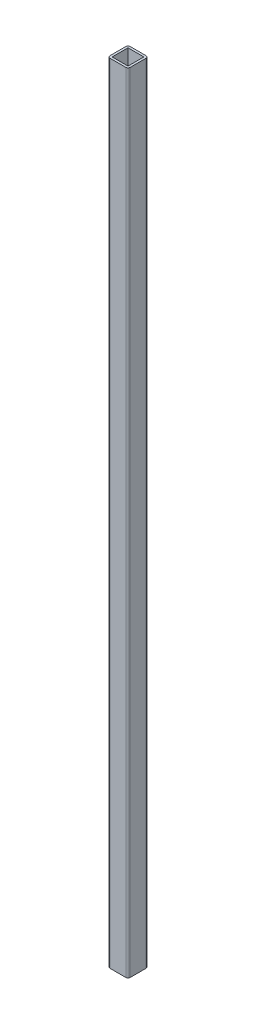
ISO-10303-21;
HEADER;
FILE_DESCRIPTION(('STEP AP214'),'2;1');
FILE_NAME('part.step','',(''),(''),'','','');
FILE_SCHEMA(('AUTOMOTIVE_DESIGN { 1 0 10303 214 1 1 1 1 }'));
ENDSEC;
DATA;
#1=APPLICATION_CONTEXT('core data for automotive mechanical design processes');
#2=APPLICATION_PROTOCOL_DEFINITION('international standard','automotive_design',2000,#1);
#3=PRODUCT_CONTEXT('',#1,'mechanical');
#4=PRODUCT('Part','Part','',(#3));
#5=PRODUCT_RELATED_PRODUCT_CATEGORY('part','',(#4));
#6=PRODUCT_DEFINITION_FORMATION('','',#4);
#7=PRODUCT_DEFINITION_CONTEXT('part definition',#1,'design');
#8=PRODUCT_DEFINITION('design','',#6,#7);
#9=PRODUCT_DEFINITION_SHAPE('','',#8);
#10=(LENGTH_UNIT() NAMED_UNIT(*) SI_UNIT(.MILLI.,.METRE.));
#11=(NAMED_UNIT(*) PLANE_ANGLE_UNIT() SI_UNIT($,.RADIAN.));
#12=(NAMED_UNIT(*) SI_UNIT($,.STERADIAN.) SOLID_ANGLE_UNIT());
#13=UNCERTAINTY_MEASURE_WITH_UNIT(LENGTH_MEASURE(1.E-05),#10,'distance_accuracy_value','');
#14=(GEOMETRIC_REPRESENTATION_CONTEXT(3) GLOBAL_UNCERTAINTY_ASSIGNED_CONTEXT((#13)) GLOBAL_UNIT_ASSIGNED_CONTEXT((#10,
#11,#12)) REPRESENTATION_CONTEXT('',''));
#15=CARTESIAN_POINT('',(0.,0.,0.));
#16=DIRECTION('',(0.,0.,1.));
#17=DIRECTION('',(1.,0.,0.));
#18=AXIS2_PLACEMENT_3D('',#15,#16,#17);
#19=CARTESIAN_POINT('',(22.8,996.1,2.8));
#20=DIRECTION('',(0.,-1.,0.));
#21=DIRECTION('',(0.,0.,-1.));
#22=AXIS2_PLACEMENT_3D('',#19,#20,#21);
#23=CYLINDRICAL_SURFACE('',#22,2.8);
#24=CARTESIAN_POINT('',(22.8,0.,2.8));
#25=DIRECTION('',(0.,1.,0.));
#26=DIRECTION('',(0.,0.,-1.));
#27=AXIS2_PLACEMENT_3D('',#24,#25,#26);
#28=CIRCLE('',#27,2.8);
#29=CARTESIAN_POINT('',(25.6,0.,2.80000000000002));
#30=VERTEX_POINT('',#29);
#31=CARTESIAN_POINT('',(22.8,0.,0.));
#32=VERTEX_POINT('',#31);
#33=EDGE_CURVE('E157',#30,#32,#28,.T.);
#34=ORIENTED_EDGE('',*,*,#33,.T.);
#35=DIRECTION('',(0.,-1.,0.));
#36=VECTOR('',#35,1.);
#37=CARTESIAN_POINT('',(22.8,996.1,0.));
#38=LINE('',#37,#36);
#39=CARTESIAN_POINT('',(22.8,996.1,0.));
#40=VERTEX_POINT('',#39);
#41=EDGE_CURVE('E11',#40,#32,#38,.T.);
#42=ORIENTED_EDGE('',*,*,#41,.F.);
#43=CARTESIAN_POINT('',(22.8,996.1,2.8));
#44=DIRECTION('',(0.,1.,0.));
#45=DIRECTION('',(0.,0.,-1.));
#46=AXIS2_PLACEMENT_3D('',#43,#44,#45);
#47=CIRCLE('',#46,2.8);
#48=CARTESIAN_POINT('',(25.6,996.1,2.80000000000002));
#49=VERTEX_POINT('',#48);
#50=EDGE_CURVE('E158',#49,#40,#47,.T.);
#51=ORIENTED_EDGE('',*,*,#50,.F.);
#52=DIRECTION('',(0.,-1.,0.));
#53=VECTOR('',#52,1.);
#54=CARTESIAN_POINT('',(25.6,996.1,2.80000000000002));
#55=LINE('',#54,#53);
#56=EDGE_CURVE('E176',#49,#30,#55,.T.);
#57=ORIENTED_EDGE('',*,*,#56,.T.);
#58=EDGE_LOOP('',(#34,#42,#51,#57));
#59=FACE_BOUND('',#58,.T.);
#60=ADVANCED_FACE('F32',(#59),#23,.T.);
#61=CARTESIAN_POINT('',(2.80000000000002,996.1,0.));
#62=DIRECTION('',(0.,0.,1.));
#63=DIRECTION('',(1.,0.,0.));
#64=AXIS2_PLACEMENT_3D('',#61,#62,#63);
#65=PLANE('',#64);
#66=DIRECTION('',(-1.,0.,0.));
#67=VECTOR('',#66,1.);
#68=CARTESIAN_POINT('',(2.80000000000002,0.,0.));
#69=LINE('',#68,#67);
#70=CARTESIAN_POINT('',(2.80000000000002,0.,0.));
#71=VERTEX_POINT('',#70);
#72=EDGE_CURVE('E179',#32,#71,#69,.T.);
#73=ORIENTED_EDGE('',*,*,#72,.T.);
#74=DIRECTION('',(0.,-1.,0.));
#75=VECTOR('',#74,1.);
#76=CARTESIAN_POINT('',(2.80000000000002,996.1,0.));
#77=LINE('',#76,#75);
#78=CARTESIAN_POINT('',(2.80000000000002,996.1,0.));
#79=VERTEX_POINT('',#78);
#80=EDGE_CURVE('E39',#79,#71,#77,.T.);
#81=ORIENTED_EDGE('',*,*,#80,.F.);
#82=DIRECTION('',(-1.,0.,0.));
#83=VECTOR('',#82,1.);
#84=CARTESIAN_POINT('',(2.80000000000002,996.1,0.));
#85=LINE('',#84,#83);
#86=EDGE_CURVE('E161',#40,#79,#85,.T.);
#87=ORIENTED_EDGE('',*,*,#86,.F.);
#88=ORIENTED_EDGE('',*,*,#41,.T.);
#89=EDGE_LOOP('',(#73,#81,#87,#88));
#90=FACE_BOUND('',#89,.T.);
#91=ADVANCED_FACE('F234',(#90),#65,.F.);
#92=CARTESIAN_POINT('',(2.8,996.1,2.8));
#93=DIRECTION('',(0.,-1.,0.));
#94=DIRECTION('',(0.,0.,-1.));
#95=AXIS2_PLACEMENT_3D('',#92,#93,#94);
#96=CYLINDRICAL_SURFACE('',#95,2.8);
#97=CARTESIAN_POINT('',(2.8,0.,2.8));
#98=DIRECTION('',(0.,1.,0.));
#99=DIRECTION('',(0.,0.,1.));
#100=AXIS2_PLACEMENT_3D('',#97,#98,#99);
#101=CIRCLE('',#100,2.8);
#102=CARTESIAN_POINT('',(0.,0.,2.80000000000002));
#103=VERTEX_POINT('',#102);
#104=EDGE_CURVE('E181',#71,#103,#101,.T.);
#105=ORIENTED_EDGE('',*,*,#104,.T.);
#106=DIRECTION('',(0.,-1.,0.));
#107=VECTOR('',#106,1.);
#108=CARTESIAN_POINT('',(0.,996.1,2.80000000000002));
#109=LINE('',#108,#107);
#110=CARTESIAN_POINT('',(0.,996.1,2.80000000000002));
#111=VERTEX_POINT('',#110);
#112=EDGE_CURVE('E206',#111,#103,#109,.T.);
#113=ORIENTED_EDGE('',*,*,#112,.F.);
#114=CARTESIAN_POINT('',(2.8,996.1,2.8));
#115=DIRECTION('',(0.,1.,0.));
#116=DIRECTION('',(0.,0.,1.));
#117=AXIS2_PLACEMENT_3D('',#114,#115,#116);
#118=CIRCLE('',#117,2.8);
#119=EDGE_CURVE('E164',#79,#111,#118,.T.);
#120=ORIENTED_EDGE('',*,*,#119,.F.);
#121=ORIENTED_EDGE('',*,*,#80,.T.);
#122=EDGE_LOOP('',(#105,#113,#120,#121));
#123=FACE_BOUND('',#122,.T.);
#124=ADVANCED_FACE('F213',(#123),#96,.T.);
#125=CARTESIAN_POINT('',(0.,996.1,2.80000000000002));
#126=DIRECTION('',(1.,0.,0.));
#127=DIRECTION('',(0.,0.,-1.));
#128=AXIS2_PLACEMENT_3D('',#125,#126,#127);
#129=PLANE('',#128);
#130=DIRECTION('',(0.,0.,1.));
#131=VECTOR('',#130,1.);
#132=CARTESIAN_POINT('',(0.,0.,2.80000000000002));
#133=LINE('',#132,#131);
#134=CARTESIAN_POINT('',(0.,0.,22.8));
#135=VERTEX_POINT('',#134);
#136=EDGE_CURVE('E183',#103,#135,#133,.T.);
#137=ORIENTED_EDGE('',*,*,#136,.T.);
#138=DIRECTION('',(0.,-1.,0.));
#139=VECTOR('',#138,1.);
#140=CARTESIAN_POINT('',(0.,996.1,22.8));
#141=LINE('',#140,#139);
#142=CARTESIAN_POINT('',(0.,996.1,22.8));
#143=VERTEX_POINT('',#142);
#144=EDGE_CURVE('E203',#143,#135,#141,.T.);
#145=ORIENTED_EDGE('',*,*,#144,.F.);
#146=DIRECTION('',(0.,0.,1.));
#147=VECTOR('',#146,1.);
#148=CARTESIAN_POINT('',(0.,996.1,2.80000000000002));
#149=LINE('',#148,#147);
#150=EDGE_CURVE('E166',#111,#143,#149,.T.);
#151=ORIENTED_EDGE('',*,*,#150,.F.);
#152=ORIENTED_EDGE('',*,*,#112,.T.);
#153=EDGE_LOOP('',(#137,#145,#151,#152));
#154=FACE_BOUND('',#153,.T.);
#155=ADVANCED_FACE('F222',(#154),#129,.F.);
#156=CARTESIAN_POINT('',(2.8,996.1,22.8));
#157=DIRECTION('',(0.,-1.,0.));
#158=DIRECTION('',(0.,0.,-1.));
#159=AXIS2_PLACEMENT_3D('',#156,#157,#158);
#160=CYLINDRICAL_SURFACE('',#159,2.8);
#161=CARTESIAN_POINT('',(2.8,0.,22.8));
#162=DIRECTION('',(0.,1.,0.));
#163=DIRECTION('',(0.,0.,1.));
#164=AXIS2_PLACEMENT_3D('',#161,#162,#163);
#165=CIRCLE('',#164,2.8);
#166=CARTESIAN_POINT('',(2.80000000000002,0.,25.6));
#167=VERTEX_POINT('',#166);
#168=EDGE_CURVE('E185',#135,#167,#165,.T.);
#169=ORIENTED_EDGE('',*,*,#168,.T.);
#170=DIRECTION('',(0.,-1.,0.));
#171=VECTOR('',#170,1.);
#172=CARTESIAN_POINT('',(2.80000000000002,996.1,25.6));
#173=LINE('',#172,#171);
#174=CARTESIAN_POINT('',(2.80000000000002,996.1,25.6));
#175=VERTEX_POINT('',#174);
#176=EDGE_CURVE('E200',#175,#167,#173,.T.);
#177=ORIENTED_EDGE('',*,*,#176,.F.);
#178=CARTESIAN_POINT('',(2.8,996.1,22.8));
#179=DIRECTION('',(0.,1.,0.));
#180=DIRECTION('',(0.,0.,1.));
#181=AXIS2_PLACEMENT_3D('',#178,#179,#180);
#182=CIRCLE('',#181,2.8);
#183=EDGE_CURVE('E168',#143,#175,#182,.T.);
#184=ORIENTED_EDGE('',*,*,#183,.F.);
#185=ORIENTED_EDGE('',*,*,#144,.T.);
#186=EDGE_LOOP('',(#169,#177,#184,#185));
#187=FACE_BOUND('',#186,.T.);
#188=ADVANCED_FACE('F226',(#187),#160,.T.);
#189=CARTESIAN_POINT('',(2.80000000000002,996.1,25.6));
#190=DIRECTION('',(0.,0.,-1.));
#191=DIRECTION('',(-1.,0.,0.));
#192=AXIS2_PLACEMENT_3D('',#189,#190,#191);
#193=PLANE('',#192);
#194=DIRECTION('',(1.,0.,0.));
#195=VECTOR('',#194,1.);
#196=CARTESIAN_POINT('',(2.80000000000002,0.,25.6));
#197=LINE('',#196,#195);
#198=CARTESIAN_POINT('',(22.8,0.,25.6));
#199=VERTEX_POINT('',#198);
#200=EDGE_CURVE('E187',#167,#199,#197,.T.);
#201=ORIENTED_EDGE('',*,*,#200,.T.);
#202=DIRECTION('',(0.,-1.,0.));
#203=VECTOR('',#202,1.);
#204=CARTESIAN_POINT('',(22.8,996.1,25.6));
#205=LINE('',#204,#203);
#206=CARTESIAN_POINT('',(22.8,996.1,25.6));
#207=VERTEX_POINT('',#206);
#208=EDGE_CURVE('E197',#207,#199,#205,.T.);
#209=ORIENTED_EDGE('',*,*,#208,.F.);
#210=DIRECTION('',(1.,0.,0.));
#211=VECTOR('',#210,1.);
#212=CARTESIAN_POINT('',(2.80000000000002,996.1,25.6));
#213=LINE('',#212,#211);
#214=EDGE_CURVE('E170',#175,#207,#213,.T.);
#215=ORIENTED_EDGE('',*,*,#214,.F.);
#216=ORIENTED_EDGE('',*,*,#176,.T.);
#217=EDGE_LOOP('',(#201,#209,#215,#216));
#218=FACE_BOUND('',#217,.T.);
#219=ADVANCED_FACE('F247',(#218),#193,.F.);
#220=CARTESIAN_POINT('',(22.8,996.1,22.8));
#221=DIRECTION('',(0.,-1.,0.));
#222=DIRECTION('',(0.,0.,-1.));
#223=AXIS2_PLACEMENT_3D('',#220,#221,#222);
#224=CYLINDRICAL_SURFACE('',#223,2.8);
#225=CARTESIAN_POINT('',(22.8,0.,22.8));
#226=DIRECTION('',(0.,1.,0.));
#227=DIRECTION('',(0.,0.,1.));
#228=AXIS2_PLACEMENT_3D('',#225,#226,#227);
#229=CIRCLE('',#228,2.8);
#230=CARTESIAN_POINT('',(25.6,0.,22.8));
#231=VERTEX_POINT('',#230);
#232=EDGE_CURVE('E189',#199,#231,#229,.T.);
#233=ORIENTED_EDGE('',*,*,#232,.T.);
#234=DIRECTION('',(0.,-1.,0.));
#235=VECTOR('',#234,1.);
#236=CARTESIAN_POINT('',(25.6,996.1,22.8));
#237=LINE('',#236,#235);
#238=CARTESIAN_POINT('',(25.6,996.1,22.8));
#239=VERTEX_POINT('',#238);
#240=EDGE_CURVE('E194',#239,#231,#237,.T.);
#241=ORIENTED_EDGE('',*,*,#240,.F.);
#242=CARTESIAN_POINT('',(22.8,996.1,22.8));
#243=DIRECTION('',(0.,1.,0.));
#244=DIRECTION('',(0.,0.,1.));
#245=AXIS2_PLACEMENT_3D('',#242,#243,#244);
#246=CIRCLE('',#245,2.8);
#247=EDGE_CURVE('E172',#207,#239,#246,.T.);
#248=ORIENTED_EDGE('',*,*,#247,.F.);
#249=ORIENTED_EDGE('',*,*,#208,.T.);
#250=EDGE_LOOP('',(#233,#241,#248,#249));
#251=FACE_BOUND('',#250,.T.);
#252=ADVANCED_FACE('F245',(#251),#224,.T.);
#253=CARTESIAN_POINT('',(25.6,996.1,2.80000000000002));
#254=DIRECTION('',(-1.,0.,0.));
#255=DIRECTION('',(0.,0.,1.));
#256=AXIS2_PLACEMENT_3D('',#253,#254,#255);
#257=PLANE('',#256);
#258=DIRECTION('',(0.,0.,-1.));
#259=VECTOR('',#258,1.);
#260=CARTESIAN_POINT('',(25.6,0.,2.80000000000002));
#261=LINE('',#260,#259);
#262=EDGE_CURVE('E162',#231,#30,#261,.T.);
#263=ORIENTED_EDGE('',*,*,#262,.T.);
#264=ORIENTED_EDGE('',*,*,#56,.F.);
#265=DIRECTION('',(0.,0.,-1.));
#266=VECTOR('',#265,1.);
#267=CARTESIAN_POINT('',(25.6,996.1,2.80000000000002));
#268=LINE('',#267,#266);
#269=EDGE_CURVE('E174',#239,#49,#268,.T.);
#270=ORIENTED_EDGE('',*,*,#269,.F.);
#271=ORIENTED_EDGE('',*,*,#240,.T.);
#272=EDGE_LOOP('',(#263,#264,#270,#271));
#273=FACE_BOUND('',#272,.T.);
#274=ADVANCED_FACE('F240',(#273),#257,.F.);
#275=CARTESIAN_POINT('',(22.8,996.1,2.8));
#276=DIRECTION('',(0.,-1.,0.));
#277=DIRECTION('',(0.,0.,-1.));
#278=AXIS2_PLACEMENT_3D('',#275,#276,#277);
#279=PLANE('',#278);
#280=DIRECTION('',(1.,0.,0.));
#281=VECTOR('',#280,1.);
#282=CARTESIAN_POINT('',(22.8,996.1,2.8));
#283=LINE('',#282,#281);
#284=CARTESIAN_POINT('',(2.8,996.1,2.8));
#285=VERTEX_POINT('',#284);
#286=CARTESIAN_POINT('',(22.8,996.1,2.8));
#287=VERTEX_POINT('',#286);
#288=EDGE_CURVE('E151',#285,#287,#283,.T.);
#289=ORIENTED_EDGE('',*,*,#288,.T.);
#290=DIRECTION('',(0.,0.,1.));
#291=VECTOR('',#290,1.);
#292=CARTESIAN_POINT('',(22.8,996.1,2.8));
#293=LINE('',#292,#291);
#294=CARTESIAN_POINT('',(22.8,996.1,22.8));
#295=VERTEX_POINT('',#294);
#296=EDGE_CURVE('E154',#287,#295,#293,.T.);
#297=ORIENTED_EDGE('',*,*,#296,.T.);
#298=DIRECTION('',(-1.,0.,0.));
#299=VECTOR('',#298,1.);
#300=CARTESIAN_POINT('',(22.8,996.1,22.8));
#301=LINE('',#300,#299);
#302=CARTESIAN_POINT('',(2.8,996.1,22.8));
#303=VERTEX_POINT('',#302);
#304=EDGE_CURVE('E146',#295,#303,#301,.T.);
#305=ORIENTED_EDGE('',*,*,#304,.T.);
#306=DIRECTION('',(0.,0.,-1.));
#307=VECTOR('',#306,1.);
#308=CARTESIAN_POINT('',(2.8,996.1,2.79999999999999));
#309=LINE('',#308,#307);
#310=EDGE_CURVE('E126',#303,#285,#309,.T.);
#311=ORIENTED_EDGE('',*,*,#310,.T.);
#312=EDGE_LOOP('',(#289,#297,#305,#311));
#313=FACE_BOUND('',#312,.T.);
#314=ORIENTED_EDGE('',*,*,#50,.T.);
#315=ORIENTED_EDGE('',*,*,#86,.T.);
#316=ORIENTED_EDGE('',*,*,#119,.T.);
#317=ORIENTED_EDGE('',*,*,#150,.T.);
#318=ORIENTED_EDGE('',*,*,#183,.T.);
#319=ORIENTED_EDGE('',*,*,#214,.T.);
#320=ORIENTED_EDGE('',*,*,#247,.T.);
#321=ORIENTED_EDGE('',*,*,#269,.T.);
#322=EDGE_LOOP('',(#314,#315,#316,#317,#318,#319,#320,#321));
#323=FACE_BOUND('',#322,.T.);
#324=ADVANCED_FACE('F230',(#313,#323),#279,.F.);
#325=CARTESIAN_POINT('',(22.8,0.,2.8));
#326=DIRECTION('',(0.,-1.,0.));
#327=DIRECTION('',(0.,0.,-1.));
#328=AXIS2_PLACEMENT_3D('',#325,#326,#327);
#329=PLANE('',#328);
#330=DIRECTION('',(0.,0.,1.));
#331=VECTOR('',#330,1.);
#332=CARTESIAN_POINT('',(22.8,0.,2.8));
#333=LINE('',#332,#331);
#334=CARTESIAN_POINT('',(22.8,0.,2.8));
#335=VERTEX_POINT('',#334);
#336=CARTESIAN_POINT('',(22.8,0.,22.8));
#337=VERTEX_POINT('',#336);
#338=EDGE_CURVE('E54',#335,#337,#333,.T.);
#339=ORIENTED_EDGE('',*,*,#338,.F.);
#340=DIRECTION('',(1.,0.,0.));
#341=VECTOR('',#340,1.);
#342=CARTESIAN_POINT('',(2.8,0.,2.8));
#343=LINE('',#342,#341);
#344=CARTESIAN_POINT('',(2.8,0.,2.8));
#345=VERTEX_POINT('',#344);
#346=EDGE_CURVE('E139',#345,#335,#343,.T.);
#347=ORIENTED_EDGE('',*,*,#346,.F.);
#348=DIRECTION('',(0.,0.,-1.));
#349=VECTOR('',#348,1.);
#350=CARTESIAN_POINT('',(2.8,0.,2.8));
#351=LINE('',#350,#349);
#352=CARTESIAN_POINT('',(2.8,0.,22.8));
#353=VERTEX_POINT('',#352);
#354=EDGE_CURVE('E123',#353,#345,#351,.T.);
#355=ORIENTED_EDGE('',*,*,#354,.F.);
#356=DIRECTION('',(-1.,0.,0.));
#357=VECTOR('',#356,1.);
#358=CARTESIAN_POINT('',(2.8,0.,22.8));
#359=LINE('',#358,#357);
#360=EDGE_CURVE('E132',#337,#353,#359,.T.);
#361=ORIENTED_EDGE('',*,*,#360,.F.);
#362=EDGE_LOOP('',(#339,#347,#355,#361));
#363=FACE_BOUND('',#362,.T.);
#364=ORIENTED_EDGE('',*,*,#33,.F.);
#365=ORIENTED_EDGE('',*,*,#262,.F.);
#366=ORIENTED_EDGE('',*,*,#232,.F.);
#367=ORIENTED_EDGE('',*,*,#200,.F.);
#368=ORIENTED_EDGE('',*,*,#168,.F.);
#369=ORIENTED_EDGE('',*,*,#136,.F.);
#370=ORIENTED_EDGE('',*,*,#104,.F.);
#371=ORIENTED_EDGE('',*,*,#72,.F.);
#372=EDGE_LOOP('',(#364,#365,#366,#367,#368,#369,#370,#371));
#373=FACE_BOUND('',#372,.T.);
#374=ADVANCED_FACE('F136',(#363,#373),#329,.T.);
#375=CARTESIAN_POINT('',(22.8,1040.5,2.8));
#376=DIRECTION('',(1.,0.,0.));
#377=DIRECTION('',(0.,0.,-1.));
#378=AXIS2_PLACEMENT_3D('',#375,#376,#377);
#379=PLANE('',#378);
#380=DIRECTION('',(0.,-1.,0.));
#381=VECTOR('',#380,1.);
#382=CARTESIAN_POINT('',(22.8,1040.5,2.8));
#383=LINE('',#382,#381);
#384=EDGE_CURVE('E144',#287,#335,#383,.T.);
#385=ORIENTED_EDGE('',*,*,#384,.T.);
#386=ORIENTED_EDGE('',*,*,#338,.T.);
#387=DIRECTION('',(0.,-1.,0.));
#388=VECTOR('',#387,1.);
#389=CARTESIAN_POINT('',(22.8,1040.5,22.8));
#390=LINE('',#389,#388);
#391=EDGE_CURVE('E129',#295,#337,#390,.T.);
#392=ORIENTED_EDGE('',*,*,#391,.F.);
#393=ORIENTED_EDGE('',*,*,#296,.F.);
#394=EDGE_LOOP('',(#385,#386,#392,#393));
#395=FACE_BOUND('',#394,.T.);
#396=ADVANCED_FACE('F310',(#395),#379,.F.);
#397=CARTESIAN_POINT('',(2.8,1040.5,2.8));
#398=DIRECTION('',(0.,0.,-1.));
#399=DIRECTION('',(-1.,0.,0.));
#400=AXIS2_PLACEMENT_3D('',#397,#398,#399);
#401=PLANE('',#400);
#402=DIRECTION('',(0.,-1.,0.));
#403=VECTOR('',#402,1.);
#404=CARTESIAN_POINT('',(2.8,1040.5,2.8));
#405=LINE('',#404,#403);
#406=EDGE_CURVE('E128',#285,#345,#405,.T.);
#407=ORIENTED_EDGE('',*,*,#406,.T.);
#408=ORIENTED_EDGE('',*,*,#346,.T.);
#409=ORIENTED_EDGE('',*,*,#384,.F.);
#410=ORIENTED_EDGE('',*,*,#288,.F.);
#411=EDGE_LOOP('',(#407,#408,#409,#410));
#412=FACE_BOUND('',#411,.T.);
#413=ADVANCED_FACE('F319',(#412),#401,.F.);
#414=CARTESIAN_POINT('',(2.8,1040.5,2.8));
#415=DIRECTION('',(-1.,0.,0.));
#416=DIRECTION('',(0.,0.,1.));
#417=AXIS2_PLACEMENT_3D('',#414,#415,#416);
#418=PLANE('',#417);
#419=DIRECTION('',(0.,-1.,0.));
#420=VECTOR('',#419,1.);
#421=CARTESIAN_POINT('',(2.8,1040.5,22.8));
#422=LINE('',#421,#420);
#423=EDGE_CURVE('E46',#303,#353,#422,.T.);
#424=ORIENTED_EDGE('',*,*,#423,.T.);
#425=ORIENTED_EDGE('',*,*,#354,.T.);
#426=ORIENTED_EDGE('',*,*,#406,.F.);
#427=ORIENTED_EDGE('',*,*,#310,.F.);
#428=EDGE_LOOP('',(#424,#425,#426,#427));
#429=FACE_BOUND('',#428,.T.);
#430=ADVANCED_FACE('F120',(#429),#418,.F.);
#431=CARTESIAN_POINT('',(2.8,1040.5,22.8));
#432=DIRECTION('',(0.,0.,1.));
#433=DIRECTION('',(1.,0.,0.));
#434=AXIS2_PLACEMENT_3D('',#431,#432,#433);
#435=PLANE('',#434);
#436=ORIENTED_EDGE('',*,*,#391,.T.);
#437=ORIENTED_EDGE('',*,*,#360,.T.);
#438=ORIENTED_EDGE('',*,*,#423,.F.);
#439=ORIENTED_EDGE('',*,*,#304,.F.);
#440=EDGE_LOOP('',(#436,#437,#438,#439));
#441=FACE_BOUND('',#440,.T.);
#442=ADVANCED_FACE('F133',(#441),#435,.F.);
#443=CLOSED_SHELL('',(#60,#91,#124,#155,#188,#219,#252,#274,#324,#374,#396,#413,#430,#442));
#444=MANIFOLD_SOLID_BREP('B2',#443);
#445=ADVANCED_BREP_SHAPE_REPRESENTATION('',(#18,#444),#14);
#446=SHAPE_DEFINITION_REPRESENTATION(#9,#445);
ENDSEC;
END-ISO-10303-21;
